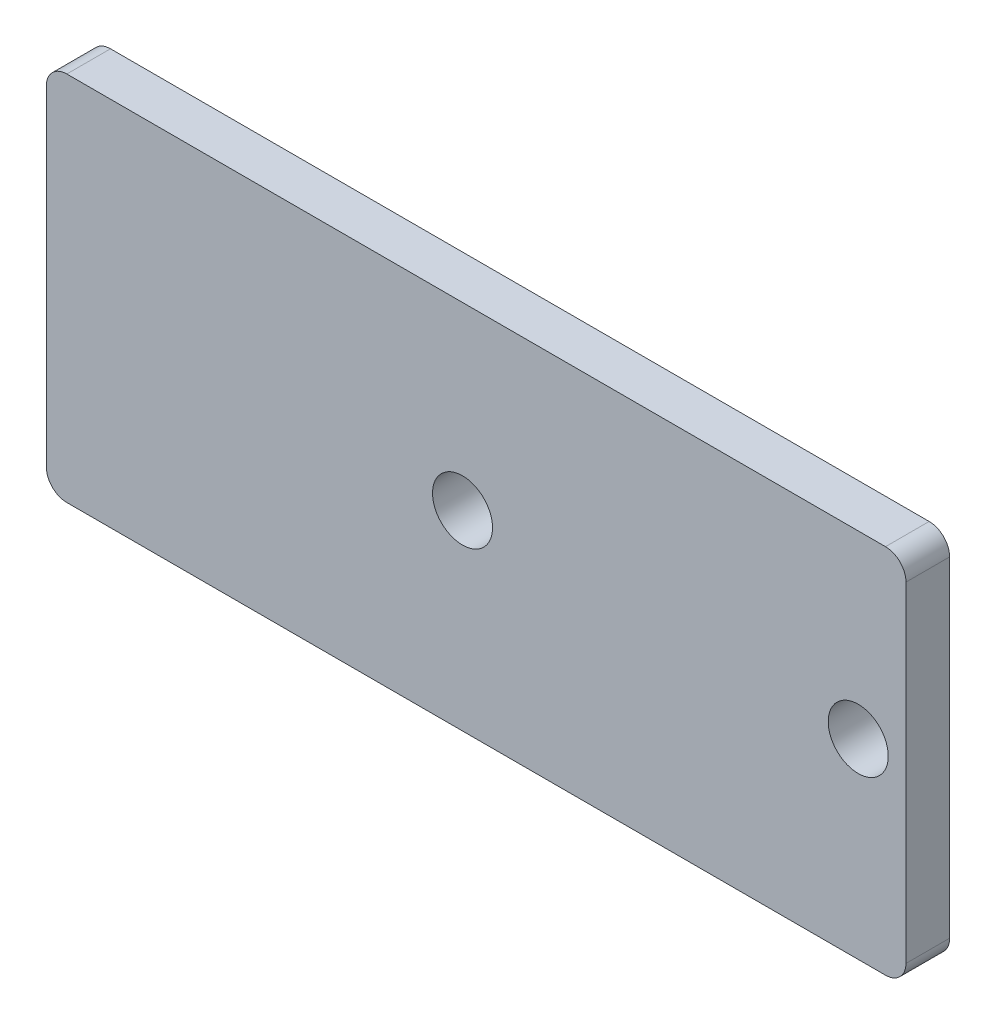
ISO-10303-21;
HEADER;
FILE_DESCRIPTION(('STEP AP214'),'2;1');
FILE_NAME('part.step','',(''),(''),'','','');
FILE_SCHEMA(('AUTOMOTIVE_DESIGN { 1 0 10303 214 1 1 1 1 }'));
ENDSEC;
DATA;
#1=APPLICATION_CONTEXT('core data for automotive mechanical design processes');
#2=APPLICATION_PROTOCOL_DEFINITION('international standard','automotive_design',2000,#1);
#3=PRODUCT_CONTEXT('',#1,'mechanical');
#4=PRODUCT('Part','Part','',(#3));
#5=PRODUCT_RELATED_PRODUCT_CATEGORY('part','',(#4));
#6=PRODUCT_DEFINITION_FORMATION('','',#4);
#7=PRODUCT_DEFINITION_CONTEXT('part definition',#1,'design');
#8=PRODUCT_DEFINITION('design','',#6,#7);
#9=PRODUCT_DEFINITION_SHAPE('','',#8);
#10=(LENGTH_UNIT() NAMED_UNIT(*) SI_UNIT(.MILLI.,.METRE.));
#11=(NAMED_UNIT(*) PLANE_ANGLE_UNIT() SI_UNIT($,.RADIAN.));
#12=(NAMED_UNIT(*) SI_UNIT($,.STERADIAN.) SOLID_ANGLE_UNIT());
#13=UNCERTAINTY_MEASURE_WITH_UNIT(LENGTH_MEASURE(1.E-05),#10,'distance_accuracy_value','');
#14=(GEOMETRIC_REPRESENTATION_CONTEXT(3) GLOBAL_UNCERTAINTY_ASSIGNED_CONTEXT((#13)) GLOBAL_UNIT_ASSIGNED_CONTEXT((#10,
#11,#12)) REPRESENTATION_CONTEXT('',''));
#15=CARTESIAN_POINT('',(0.,0.,0.));
#16=DIRECTION('',(0.,0.,1.));
#17=DIRECTION('',(1.,0.,0.));
#18=AXIS2_PLACEMENT_3D('',#15,#16,#17);
#19=CARTESIAN_POINT('',(-15.,6.05,0.8));
#20=DIRECTION('',(0.,0.,1.));
#21=DIRECTION('',(1.,0.,0.));
#22=AXIS2_PLACEMENT_3D('',#19,#20,#21);
#23=PLANE('',#22);
#24=CARTESIAN_POINT('',(-0.5,0.200000000000001,0.8));
#25=DIRECTION('',(0.,0.,1.));
#26=DIRECTION('',(1.,0.,0.));
#27=AXIS2_PLACEMENT_3D('',#24,#25,#26);
#28=CIRCLE('',#27,1.1);
#29=CARTESIAN_POINT('',(0.599999999999999,0.200000000000001,0.8));
#30=VERTEX_POINT('',#29);
#31=EDGE_CURVE('E140',#30,#30,#28,.T.);
#32=ORIENTED_EDGE('',*,*,#31,.F.);
#33=EDGE_LOOP('',(#32));
#34=FACE_BOUND('',#33,.T.);
#35=CARTESIAN_POINT('',(-15.,6.05,0.8));
#36=DIRECTION('',(0.,0.,1.));
#37=DIRECTION('',(1.,0.,0.));
#38=AXIS2_PLACEMENT_3D('',#35,#36,#37);
#39=CIRCLE('',#38,0.750000000000002);
#40=CARTESIAN_POINT('',(-15.,6.8,0.8));
#41=VERTEX_POINT('',#40);
#42=CARTESIAN_POINT('',(-15.75,6.05,0.8));
#43=VERTEX_POINT('',#42);
#44=EDGE_CURVE('E151',#41,#43,#39,.T.);
#45=ORIENTED_EDGE('',*,*,#44,.T.);
#46=DIRECTION('',(0.,-1.,0.));
#47=VECTOR('',#46,1.);
#48=CARTESIAN_POINT('',(-15.75,6.05,0.8));
#49=LINE('',#48,#47);
#50=CARTESIAN_POINT('',(-15.75,-6.05,0.8));
#51=VERTEX_POINT('',#50);
#52=EDGE_CURVE('E99',#43,#51,#49,.T.);
#53=ORIENTED_EDGE('',*,*,#52,.T.);
#54=CARTESIAN_POINT('',(-15.,-6.05,0.8));
#55=DIRECTION('',(0.,0.,1.));
#56=DIRECTION('',(-1.,0.,0.));
#57=AXIS2_PLACEMENT_3D('',#54,#55,#56);
#58=CIRCLE('',#57,0.750000000000002);
#59=CARTESIAN_POINT('',(-15.,-6.8,0.8));
#60=VERTEX_POINT('',#59);
#61=EDGE_CURVE('E166',#51,#60,#58,.T.);
#62=ORIENTED_EDGE('',*,*,#61,.T.);
#63=DIRECTION('',(1.,0.,0.));
#64=VECTOR('',#63,1.);
#65=CARTESIAN_POINT('',(-15.,-6.8,0.8));
#66=LINE('',#65,#64);
#67=CARTESIAN_POINT('',(15.,-6.8,0.8));
#68=VERTEX_POINT('',#67);
#69=EDGE_CURVE('E179',#60,#68,#66,.T.);
#70=ORIENTED_EDGE('',*,*,#69,.T.);
#71=CARTESIAN_POINT('',(15.,-6.05,0.8));
#72=DIRECTION('',(0.,0.,1.));
#73=DIRECTION('',(1.,0.,0.));
#74=AXIS2_PLACEMENT_3D('',#71,#72,#73);
#75=CIRCLE('',#74,0.750000000000002);
#76=CARTESIAN_POINT('',(15.75,-6.05,0.8));
#77=VERTEX_POINT('',#76);
#78=EDGE_CURVE('E118',#68,#77,#75,.T.);
#79=ORIENTED_EDGE('',*,*,#78,.T.);
#80=DIRECTION('',(0.,1.,0.));
#81=VECTOR('',#80,1.);
#82=CARTESIAN_POINT('',(15.75,-6.05,0.8));
#83=LINE('',#82,#81);
#84=CARTESIAN_POINT('',(15.75,6.05,0.8));
#85=VERTEX_POINT('',#84);
#86=EDGE_CURVE('E112',#77,#85,#83,.T.);
#87=ORIENTED_EDGE('',*,*,#86,.T.);
#88=CARTESIAN_POINT('',(15.,6.05,0.8));
#89=DIRECTION('',(0.,0.,1.));
#90=DIRECTION('',(-1.,0.,0.));
#91=AXIS2_PLACEMENT_3D('',#88,#89,#90);
#92=CIRCLE('',#91,0.750000000000002);
#93=CARTESIAN_POINT('',(15.,6.8,0.8));
#94=VERTEX_POINT('',#93);
#95=EDGE_CURVE('E116',#85,#94,#92,.T.);
#96=ORIENTED_EDGE('',*,*,#95,.T.);
#97=DIRECTION('',(-1.,0.,0.));
#98=VECTOR('',#97,1.);
#99=CARTESIAN_POINT('',(-15.,6.8,0.8));
#100=LINE('',#99,#98);
#101=EDGE_CURVE('E56',#94,#41,#100,.T.);
#102=ORIENTED_EDGE('',*,*,#101,.T.);
#103=EDGE_LOOP('',(#45,#53,#62,#70,#79,#87,#96,#102));
#104=FACE_BOUND('',#103,.T.);
#105=CARTESIAN_POINT('',(14.,0.200000000000001,0.8));
#106=DIRECTION('',(0.,0.,1.));
#107=DIRECTION('',(1.,0.,0.));
#108=AXIS2_PLACEMENT_3D('',#105,#106,#107);
#109=CIRCLE('',#108,1.1);
#110=CARTESIAN_POINT('',(15.1,0.200000000000001,0.8));
#111=VERTEX_POINT('',#110);
#112=EDGE_CURVE('E188',#111,#111,#109,.T.);
#113=ORIENTED_EDGE('',*,*,#112,.F.);
#114=EDGE_LOOP('',(#113));
#115=FACE_BOUND('',#114,.T.);
#116=ADVANCED_FACE('F39',(#34,#104,#115),#23,.T.);
#117=CARTESIAN_POINT('',(-15.,6.05,-0.8));
#118=DIRECTION('',(0.,0.,1.));
#119=DIRECTION('',(1.,0.,0.));
#120=AXIS2_PLACEMENT_3D('',#117,#118,#119);
#121=PLANE('',#120);
#122=CARTESIAN_POINT('',(-15.,6.05,-0.8));
#123=DIRECTION('',(0.,0.,1.));
#124=DIRECTION('',(1.,0.,0.));
#125=AXIS2_PLACEMENT_3D('',#122,#123,#124);
#126=CIRCLE('',#125,0.750000000000002);
#127=CARTESIAN_POINT('',(-15.,6.8,-0.8));
#128=VERTEX_POINT('',#127);
#129=CARTESIAN_POINT('',(-15.75,6.05,-0.8));
#130=VERTEX_POINT('',#129);
#131=EDGE_CURVE('E136',#128,#130,#126,.T.);
#132=ORIENTED_EDGE('',*,*,#131,.F.);
#133=DIRECTION('',(-1.,0.,0.));
#134=VECTOR('',#133,1.);
#135=CARTESIAN_POINT('',(-15.,6.8,-0.8));
#136=LINE('',#135,#134);
#137=CARTESIAN_POINT('',(15.,6.8,-0.8));
#138=VERTEX_POINT('',#137);
#139=EDGE_CURVE('E91',#138,#128,#136,.T.);
#140=ORIENTED_EDGE('',*,*,#139,.F.);
#141=CARTESIAN_POINT('',(15.,6.05,-0.8));
#142=DIRECTION('',(0.,0.,1.));
#143=DIRECTION('',(-1.,0.,0.));
#144=AXIS2_PLACEMENT_3D('',#141,#142,#143);
#145=CIRCLE('',#144,0.750000000000002);
#146=CARTESIAN_POINT('',(15.75,6.05,-0.8));
#147=VERTEX_POINT('',#146);
#148=EDGE_CURVE('E85',#147,#138,#145,.T.);
#149=ORIENTED_EDGE('',*,*,#148,.F.);
#150=DIRECTION('',(0.,1.,0.));
#151=VECTOR('',#150,1.);
#152=CARTESIAN_POINT('',(15.75,-6.05,-0.8));
#153=LINE('',#152,#151);
#154=CARTESIAN_POINT('',(15.75,-6.05,-0.8));
#155=VERTEX_POINT('',#154);
#156=EDGE_CURVE('E126',#155,#147,#153,.T.);
#157=ORIENTED_EDGE('',*,*,#156,.F.);
#158=CARTESIAN_POINT('',(15.,-6.05,-0.8));
#159=DIRECTION('',(0.,0.,1.));
#160=DIRECTION('',(1.,0.,0.));
#161=AXIS2_PLACEMENT_3D('',#158,#159,#160);
#162=CIRCLE('',#161,0.750000000000002);
#163=CARTESIAN_POINT('',(15.,-6.8,-0.8));
#164=VERTEX_POINT('',#163);
#165=EDGE_CURVE('E146',#164,#155,#162,.T.);
#166=ORIENTED_EDGE('',*,*,#165,.F.);
#167=DIRECTION('',(1.,0.,0.));
#168=VECTOR('',#167,1.);
#169=CARTESIAN_POINT('',(-15.,-6.8,-0.8));
#170=LINE('',#169,#168);
#171=CARTESIAN_POINT('',(-15.,-6.8,-0.8));
#172=VERTEX_POINT('',#171);
#173=EDGE_CURVE('E144',#172,#164,#170,.T.);
#174=ORIENTED_EDGE('',*,*,#173,.F.);
#175=CARTESIAN_POINT('',(-15.,-6.05,-0.8));
#176=DIRECTION('',(0.,0.,1.));
#177=DIRECTION('',(-1.,0.,0.));
#178=AXIS2_PLACEMENT_3D('',#175,#176,#177);
#179=CIRCLE('',#178,0.750000000000002);
#180=CARTESIAN_POINT('',(-15.75,-6.05,-0.8));
#181=VERTEX_POINT('',#180);
#182=EDGE_CURVE('E142',#181,#172,#179,.T.);
#183=ORIENTED_EDGE('',*,*,#182,.F.);
#184=DIRECTION('',(0.,-1.,0.));
#185=VECTOR('',#184,1.);
#186=CARTESIAN_POINT('',(-15.75,6.05,-0.8));
#187=LINE('',#186,#185);
#188=EDGE_CURVE('E139',#130,#181,#187,.T.);
#189=ORIENTED_EDGE('',*,*,#188,.F.);
#190=EDGE_LOOP('',(#132,#140,#149,#157,#166,#174,#183,#189));
#191=FACE_BOUND('',#190,.T.);
#192=CARTESIAN_POINT('',(-0.5,0.200000000000001,-0.8));
#193=DIRECTION('',(0.,0.,1.));
#194=DIRECTION('',(1.,0.,0.));
#195=AXIS2_PLACEMENT_3D('',#192,#193,#194);
#196=CIRCLE('',#195,1.1);
#197=CARTESIAN_POINT('',(0.599999999999999,0.200000000000001,-0.8));
#198=VERTEX_POINT('',#197);
#199=EDGE_CURVE('E185',#198,#198,#196,.T.);
#200=ORIENTED_EDGE('',*,*,#199,.T.);
#201=EDGE_LOOP('',(#200));
#202=FACE_BOUND('',#201,.T.);
#203=CARTESIAN_POINT('',(14.,0.200000000000001,-0.8));
#204=DIRECTION('',(0.,0.,1.));
#205=DIRECTION('',(1.,0.,0.));
#206=AXIS2_PLACEMENT_3D('',#203,#204,#205);
#207=CIRCLE('',#206,1.1);
#208=CARTESIAN_POINT('',(15.1,0.200000000000001,-0.8));
#209=VERTEX_POINT('',#208);
#210=EDGE_CURVE('E191',#209,#209,#207,.T.);
#211=ORIENTED_EDGE('',*,*,#210,.T.);
#212=EDGE_LOOP('',(#211));
#213=FACE_BOUND('',#212,.T.);
#214=ADVANCED_FACE('F170',(#191,#202,#213),#121,.F.);
#215=CARTESIAN_POINT('',(-15.,6.05,0.8));
#216=DIRECTION('',(0.,0.,-1.));
#217=DIRECTION('',(-1.,0.,0.));
#218=AXIS2_PLACEMENT_3D('',#215,#216,#217);
#219=CYLINDRICAL_SURFACE('',#218,0.750000000000002);
#220=ORIENTED_EDGE('',*,*,#131,.T.);
#221=DIRECTION('',(0.,0.,-1.));
#222=VECTOR('',#221,1.);
#223=CARTESIAN_POINT('',(-15.75,6.05,0.8));
#224=LINE('',#223,#222);
#225=EDGE_CURVE('E11',#43,#130,#224,.T.);
#226=ORIENTED_EDGE('',*,*,#225,.F.);
#227=ORIENTED_EDGE('',*,*,#44,.F.);
#228=DIRECTION('',(0.,0.,-1.));
#229=VECTOR('',#228,1.);
#230=CARTESIAN_POINT('',(-15.,6.8,0.8));
#231=LINE('',#230,#229);
#232=EDGE_CURVE('E132',#41,#128,#231,.T.);
#233=ORIENTED_EDGE('',*,*,#232,.T.);
#234=EDGE_LOOP('',(#220,#226,#227,#233));
#235=FACE_BOUND('',#234,.T.);
#236=ADVANCED_FACE('F41',(#235),#219,.T.);
#237=CARTESIAN_POINT('',(-15.75,6.05,0.8));
#238=DIRECTION('',(1.,0.,0.));
#239=DIRECTION('',(0.,0.,-1.));
#240=AXIS2_PLACEMENT_3D('',#237,#238,#239);
#241=PLANE('',#240);
#242=ORIENTED_EDGE('',*,*,#188,.T.);
#243=DIRECTION('',(0.,0.,-1.));
#244=VECTOR('',#243,1.);
#245=CARTESIAN_POINT('',(-15.75,-6.05,0.8));
#246=LINE('',#245,#244);
#247=EDGE_CURVE('E48',#51,#181,#246,.T.);
#248=ORIENTED_EDGE('',*,*,#247,.F.);
#249=ORIENTED_EDGE('',*,*,#52,.F.);
#250=ORIENTED_EDGE('',*,*,#225,.T.);
#251=EDGE_LOOP('',(#242,#248,#249,#250));
#252=FACE_BOUND('',#251,.T.);
#253=ADVANCED_FACE('F223',(#252),#241,.F.);
#254=CARTESIAN_POINT('',(-15.,-6.05,0.8));
#255=DIRECTION('',(0.,0.,-1.));
#256=DIRECTION('',(-1.,0.,0.));
#257=AXIS2_PLACEMENT_3D('',#254,#255,#256);
#258=CYLINDRICAL_SURFACE('',#257,0.750000000000002);
#259=ORIENTED_EDGE('',*,*,#182,.T.);
#260=DIRECTION('',(0.,0.,-1.));
#261=VECTOR('',#260,1.);
#262=CARTESIAN_POINT('',(-15.,-6.8,0.8));
#263=LINE('',#262,#261);
#264=EDGE_CURVE('E158',#60,#172,#263,.T.);
#265=ORIENTED_EDGE('',*,*,#264,.F.);
#266=ORIENTED_EDGE('',*,*,#61,.F.);
#267=ORIENTED_EDGE('',*,*,#247,.T.);
#268=EDGE_LOOP('',(#259,#265,#266,#267));
#269=FACE_BOUND('',#268,.T.);
#270=ADVANCED_FACE('F164',(#269),#258,.T.);
#271=CARTESIAN_POINT('',(-15.,-6.8,0.8));
#272=DIRECTION('',(0.,1.,0.));
#273=DIRECTION('',(0.,0.,1.));
#274=AXIS2_PLACEMENT_3D('',#271,#272,#273);
#275=PLANE('',#274);
#276=ORIENTED_EDGE('',*,*,#173,.T.);
#277=DIRECTION('',(0.,0.,-1.));
#278=VECTOR('',#277,1.);
#279=CARTESIAN_POINT('',(15.,-6.8,0.8));
#280=LINE('',#279,#278);
#281=EDGE_CURVE('E155',#68,#164,#280,.T.);
#282=ORIENTED_EDGE('',*,*,#281,.F.);
#283=ORIENTED_EDGE('',*,*,#69,.F.);
#284=ORIENTED_EDGE('',*,*,#264,.T.);
#285=EDGE_LOOP('',(#276,#282,#283,#284));
#286=FACE_BOUND('',#285,.T.);
#287=ADVANCED_FACE('F175',(#286),#275,.F.);
#288=CARTESIAN_POINT('',(15.,-6.05,0.8));
#289=DIRECTION('',(0.,0.,-1.));
#290=DIRECTION('',(-1.,0.,0.));
#291=AXIS2_PLACEMENT_3D('',#288,#289,#290);
#292=CYLINDRICAL_SURFACE('',#291,0.750000000000002);
#293=ORIENTED_EDGE('',*,*,#165,.T.);
#294=DIRECTION('',(0.,0.,-1.));
#295=VECTOR('',#294,1.);
#296=CARTESIAN_POINT('',(15.75,-6.05,0.8));
#297=LINE('',#296,#295);
#298=EDGE_CURVE('E127',#77,#155,#297,.T.);
#299=ORIENTED_EDGE('',*,*,#298,.F.);
#300=ORIENTED_EDGE('',*,*,#78,.F.);
#301=ORIENTED_EDGE('',*,*,#281,.T.);
#302=EDGE_LOOP('',(#293,#299,#300,#301));
#303=FACE_BOUND('',#302,.T.);
#304=ADVANCED_FACE('F178',(#303),#292,.T.);
#305=CARTESIAN_POINT('',(15.75,-6.05,0.8));
#306=DIRECTION('',(-1.,0.,0.));
#307=DIRECTION('',(0.,0.,1.));
#308=AXIS2_PLACEMENT_3D('',#305,#306,#307);
#309=PLANE('',#308);
#310=ORIENTED_EDGE('',*,*,#156,.T.);
#311=DIRECTION('',(0.,0.,-1.));
#312=VECTOR('',#311,1.);
#313=CARTESIAN_POINT('',(15.75,6.05,0.8));
#314=LINE('',#313,#312);
#315=EDGE_CURVE('E123',#85,#147,#314,.T.);
#316=ORIENTED_EDGE('',*,*,#315,.F.);
#317=ORIENTED_EDGE('',*,*,#86,.F.);
#318=ORIENTED_EDGE('',*,*,#298,.T.);
#319=EDGE_LOOP('',(#310,#316,#317,#318));
#320=FACE_BOUND('',#319,.T.);
#321=ADVANCED_FACE('F124',(#320),#309,.F.);
#322=CARTESIAN_POINT('',(15.,6.05,0.8));
#323=DIRECTION('',(0.,0.,-1.));
#324=DIRECTION('',(-1.,0.,0.));
#325=AXIS2_PLACEMENT_3D('',#322,#323,#324);
#326=CYLINDRICAL_SURFACE('',#325,0.750000000000002);
#327=ORIENTED_EDGE('',*,*,#148,.T.);
#328=DIRECTION('',(0.,0.,-1.));
#329=VECTOR('',#328,1.);
#330=CARTESIAN_POINT('',(15.,6.8,0.8));
#331=LINE('',#330,#329);
#332=EDGE_CURVE('E128',#94,#138,#331,.T.);
#333=ORIENTED_EDGE('',*,*,#332,.F.);
#334=ORIENTED_EDGE('',*,*,#95,.F.);
#335=ORIENTED_EDGE('',*,*,#315,.T.);
#336=EDGE_LOOP('',(#327,#333,#334,#335));
#337=FACE_BOUND('',#336,.T.);
#338=ADVANCED_FACE('F130',(#337),#326,.T.);
#339=CARTESIAN_POINT('',(-15.,6.8,0.8));
#340=DIRECTION('',(0.,-1.,0.));
#341=DIRECTION('',(0.,0.,-1.));
#342=AXIS2_PLACEMENT_3D('',#339,#340,#341);
#343=PLANE('',#342);
#344=ORIENTED_EDGE('',*,*,#139,.T.);
#345=ORIENTED_EDGE('',*,*,#232,.F.);
#346=ORIENTED_EDGE('',*,*,#101,.F.);
#347=ORIENTED_EDGE('',*,*,#332,.T.);
#348=EDGE_LOOP('',(#344,#345,#346,#347));
#349=FACE_BOUND('',#348,.T.);
#350=ADVANCED_FACE('F211',(#349),#343,.F.);
#351=CARTESIAN_POINT('',(-0.5,0.200000000000001,0.8));
#352=DIRECTION('',(0.,0.,-1.));
#353=DIRECTION('',(-1.,0.,0.));
#354=AXIS2_PLACEMENT_3D('',#351,#352,#353);
#355=CYLINDRICAL_SURFACE('',#354,1.1);
#356=ORIENTED_EDGE('',*,*,#31,.T.);
#357=EDGE_LOOP('',(#356));
#358=FACE_BOUND('',#357,.T.);
#359=ORIENTED_EDGE('',*,*,#199,.F.);
#360=EDGE_LOOP('',(#359));
#361=FACE_BOUND('',#360,.T.);
#362=ADVANCED_FACE('F208',(#358,#361),#355,.F.);
#363=CARTESIAN_POINT('',(14.,0.200000000000001,0.8));
#364=DIRECTION('',(0.,0.,-1.));
#365=DIRECTION('',(-1.,0.,0.));
#366=AXIS2_PLACEMENT_3D('',#363,#364,#365);
#367=CYLINDRICAL_SURFACE('',#366,1.1);
#368=ORIENTED_EDGE('',*,*,#112,.T.);
#369=EDGE_LOOP('',(#368));
#370=FACE_BOUND('',#369,.T.);
#371=ORIENTED_EDGE('',*,*,#210,.F.);
#372=EDGE_LOOP('',(#371));
#373=FACE_BOUND('',#372,.T.);
#374=ADVANCED_FACE('F197',(#370,#373),#367,.F.);
#375=CLOSED_SHELL('',(#116,#214,#236,#253,#270,#287,#304,#321,#338,#350,#362,#374));
#376=MANIFOLD_SOLID_BREP('B2',#375);
#377=ADVANCED_BREP_SHAPE_REPRESENTATION('',(#18,#376),#14);
#378=SHAPE_DEFINITION_REPRESENTATION(#9,#377);
ENDSEC;
END-ISO-10303-21;
